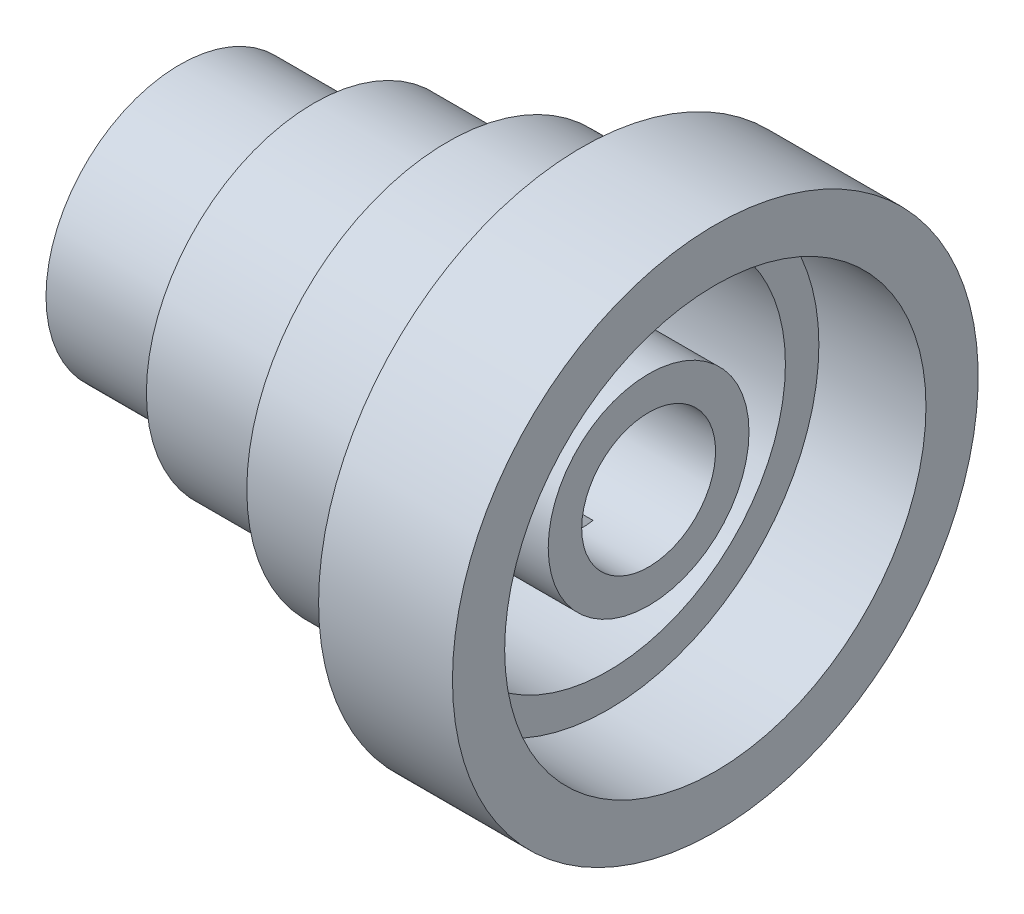
ISO-10303-21;
HEADER;
FILE_DESCRIPTION(('STEP AP214'),'2;1');
FILE_NAME('part.step','',(''),(''),'','','');
FILE_SCHEMA(('AUTOMOTIVE_DESIGN { 1 0 10303 214 1 1 1 1 }'));
ENDSEC;
DATA;
#1=APPLICATION_CONTEXT('core data for automotive mechanical design processes');
#2=APPLICATION_PROTOCOL_DEFINITION('international standard','automotive_design',2000,#1);
#3=PRODUCT_CONTEXT('',#1,'mechanical');
#4=PRODUCT('Part','Part','',(#3));
#5=PRODUCT_RELATED_PRODUCT_CATEGORY('part','',(#4));
#6=PRODUCT_DEFINITION_FORMATION('','',#4);
#7=PRODUCT_DEFINITION_CONTEXT('part definition',#1,'design');
#8=PRODUCT_DEFINITION('design','',#6,#7);
#9=PRODUCT_DEFINITION_SHAPE('','',#8);
#10=(LENGTH_UNIT() NAMED_UNIT(*) SI_UNIT(.MILLI.,.METRE.));
#11=(NAMED_UNIT(*) PLANE_ANGLE_UNIT() SI_UNIT($,.RADIAN.));
#12=(NAMED_UNIT(*) SI_UNIT($,.STERADIAN.) SOLID_ANGLE_UNIT());
#13=UNCERTAINTY_MEASURE_WITH_UNIT(LENGTH_MEASURE(1.E-05),#10,'distance_accuracy_value','');
#14=(GEOMETRIC_REPRESENTATION_CONTEXT(3) GLOBAL_UNCERTAINTY_ASSIGNED_CONTEXT((#13)) GLOBAL_UNIT_ASSIGNED_CONTEXT((#10,
#11,#12)) REPRESENTATION_CONTEXT('',''));
#15=CARTESIAN_POINT('',(0.,0.,0.));
#16=DIRECTION('',(0.,0.,1.));
#17=DIRECTION('',(1.,0.,0.));
#18=AXIS2_PLACEMENT_3D('',#15,#16,#17);
#19=CARTESIAN_POINT('',(-87.4740484429066,0.,-40.));
#20=DIRECTION('',(1.,0.,0.));
#21=DIRECTION('',(0.,0.,-1.));
#22=AXIS2_PLACEMENT_3D('',#19,#20,#21);
#23=PLANE('',#22);
#24=DIRECTION('',(0.,0.,1.));
#25=VECTOR('',#24,1.);
#26=CARTESIAN_POINT('',(-87.4740484429066,-25.786795458556,-3.47024510649693));
#27=LINE('',#26,#25);
#28=CARTESIAN_POINT('',(-87.4740484429066,-25.786795458556,-3.47024510649693));
#29=VERTEX_POINT('',#28);
#30=CARTESIAN_POINT('',(-87.4740484429066,-25.786795458556,6.86331613386226));
#31=VERTEX_POINT('',#30);
#32=EDGE_CURVE('E89',#29,#31,#27,.T.);
#33=ORIENTED_EDGE('',*,*,#32,.F.);
#34=DIRECTION('',(0.,-1.,0.));
#35=VECTOR('',#34,1.);
#36=CARTESIAN_POINT('',(-87.4740484429066,-25.786795458556,-3.47024510649693));
#37=LINE('',#36,#35);
#38=CARTESIAN_POINT('',(-87.4740484429066,-19.6966342023411,-3.47024510649693));
#39=VERTEX_POINT('',#38);
#40=EDGE_CURVE('E103',#39,#29,#37,.T.);
#41=ORIENTED_EDGE('',*,*,#40,.F.);
#42=CARTESIAN_POINT('',(-87.4740484429066,0.,0.));
#43=DIRECTION('',(-1.,0.,0.));
#44=DIRECTION('',(0.,0.,1.));
#45=AXIS2_PLACEMENT_3D('',#42,#43,#44);
#46=CIRCLE('',#45,20.);
#47=CARTESIAN_POINT('',(-87.4740484429066,-18.785496843221,6.86331613386226));
#48=VERTEX_POINT('',#47);
#49=EDGE_CURVE('E51',#48,#39,#46,.T.);
#50=ORIENTED_EDGE('',*,*,#49,.F.);
#51=DIRECTION('',(0.,1.,0.));
#52=VECTOR('',#51,1.);
#53=CARTESIAN_POINT('',(-87.4740484429066,-25.786795458556,6.86331613386226));
#54=LINE('',#53,#52);
#55=EDGE_CURVE('E106',#31,#48,#54,.T.);
#56=ORIENTED_EDGE('',*,*,#55,.F.);
#57=EDGE_LOOP('',(#33,#41,#50,#56));
#58=FACE_BOUND('',#57,.T.);
#59=CARTESIAN_POINT('',(-87.4740484429066,0.,0.));
#60=DIRECTION('',(-1.,0.,0.));
#61=DIRECTION('',(0.,0.,1.));
#62=AXIS2_PLACEMENT_3D('',#59,#60,#61);
#63=CIRCLE('',#62,40.);
#64=CARTESIAN_POINT('',(-87.4740484429066,0.,40.));
#65=VERTEX_POINT('',#64);
#66=EDGE_CURVE('E117',#65,#65,#63,.T.);
#67=ORIENTED_EDGE('',*,*,#66,.T.);
#68=EDGE_LOOP('',(#67));
#69=FACE_BOUND('',#68,.T.);
#70=ADVANCED_FACE('F43',(#58,#69),#23,.F.);
#71=CARTESIAN_POINT('',(-87.4740484429066,0.,0.));
#72=DIRECTION('',(-1.,0.,0.));
#73=DIRECTION('',(0.,0.,1.));
#74=AXIS2_PLACEMENT_3D('',#71,#72,#73);
#75=CYLINDRICAL_SURFACE('',#74,20.);
#76=ORIENTED_EDGE('',*,*,#49,.T.);
#77=DIRECTION('',(-1.,0.,0.));
#78=VECTOR('',#77,1.);
#79=CARTESIAN_POINT('',(32.5259515570934,-19.6966342023411,-3.47024510649693));
#80=LINE('',#79,#78);
#81=CARTESIAN_POINT('',(32.5259515570934,-19.6966342023411,-3.47024510649693));
#82=VERTEX_POINT('',#81);
#83=EDGE_CURVE('E118',#82,#39,#80,.T.);
#84=ORIENTED_EDGE('',*,*,#83,.F.);
#85=CARTESIAN_POINT('',(32.5259515570934,0.,0.));
#86=DIRECTION('',(-1.,0.,0.));
#87=DIRECTION('',(0.,0.,1.));
#88=AXIS2_PLACEMENT_3D('',#85,#86,#87);
#89=CIRCLE('',#88,20.);
#90=CARTESIAN_POINT('',(32.5259515570934,-18.785496843221,6.86331613386226));
#91=VERTEX_POINT('',#90);
#92=EDGE_CURVE('E11',#91,#82,#89,.F.);
#93=ORIENTED_EDGE('',*,*,#92,.F.);
#94=DIRECTION('',(-1.,0.,0.));
#95=VECTOR('',#94,1.);
#96=CARTESIAN_POINT('',(32.5259515570934,-18.785496843221,6.86331613386226));
#97=LINE('',#96,#95);
#98=EDGE_CURVE('E93',#91,#48,#97,.T.);
#99=ORIENTED_EDGE('',*,*,#98,.T.);
#100=EDGE_LOOP('',(#76,#84,#93,#99));
#101=FACE_BOUND('',#100,.T.);
#102=CARTESIAN_POINT('',(52.5951557093426,0.,0.));
#103=DIRECTION('',(-1.,0.,0.));
#104=DIRECTION('',(0.,0.,1.));
#105=AXIS2_PLACEMENT_3D('',#102,#103,#104);
#106=CIRCLE('',#105,20.);
#107=CARTESIAN_POINT('',(52.5951557093426,0.,20.));
#108=VERTEX_POINT('',#107);
#109=EDGE_CURVE('E186',#108,#108,#106,.T.);
#110=ORIENTED_EDGE('',*,*,#109,.F.);
#111=EDGE_LOOP('',(#110));
#112=FACE_BOUND('',#111,.T.);
#113=ADVANCED_FACE('F194',(#101,#112),#75,.F.);
#114=CARTESIAN_POINT('',(52.5951557093426,0.,-20.));
#115=DIRECTION('',(-1.,0.,0.));
#116=DIRECTION('',(0.,0.,1.));
#117=AXIS2_PLACEMENT_3D('',#114,#115,#116);
#118=PLANE('',#117);
#119=CARTESIAN_POINT('',(52.5951557093426,0.,0.));
#120=DIRECTION('',(-1.,0.,0.));
#121=DIRECTION('',(0.,0.,1.));
#122=AXIS2_PLACEMENT_3D('',#119,#120,#121);
#123=CIRCLE('',#122,30.);
#124=CARTESIAN_POINT('',(52.5951557093426,0.,30.));
#125=VERTEX_POINT('',#124);
#126=EDGE_CURVE('E182',#125,#125,#123,.T.);
#127=ORIENTED_EDGE('',*,*,#126,.F.);
#128=EDGE_LOOP('',(#127));
#129=FACE_BOUND('',#128,.T.);
#130=ORIENTED_EDGE('',*,*,#109,.T.);
#131=EDGE_LOOP('',(#130));
#132=FACE_BOUND('',#131,.T.);
#133=ADVANCED_FACE('F213',(#129,#132),#118,.F.);
#134=CARTESIAN_POINT('',(-87.4740484429066,0.,0.));
#135=DIRECTION('',(-1.,0.,0.));
#136=DIRECTION('',(0.,0.,1.));
#137=AXIS2_PLACEMENT_3D('',#134,#135,#136);
#138=CYLINDRICAL_SURFACE('',#137,30.);
#139=CARTESIAN_POINT('',(-39.4740484429066,0.,0.));
#140=DIRECTION('',(-1.,0.,0.));
#141=DIRECTION('',(0.,0.,1.));
#142=AXIS2_PLACEMENT_3D('',#139,#140,#141);
#143=CIRCLE('',#142,30.);
#144=CARTESIAN_POINT('',(-39.4740484429066,0.,30.));
#145=VERTEX_POINT('',#144);
#146=EDGE_CURVE('E178',#145,#145,#143,.T.);
#147=ORIENTED_EDGE('',*,*,#146,.F.);
#148=EDGE_LOOP('',(#147));
#149=FACE_BOUND('',#148,.T.);
#150=ORIENTED_EDGE('',*,*,#126,.T.);
#151=EDGE_LOOP('',(#150));
#152=FACE_BOUND('',#151,.T.);
#153=ADVANCED_FACE('F217',(#149,#152),#138,.T.);
#154=CARTESIAN_POINT('',(-39.4740484429066,0.,-30.));
#155=DIRECTION('',(-1.,0.,0.));
#156=DIRECTION('',(0.,0.,1.));
#157=AXIS2_PLACEMENT_3D('',#154,#155,#156);
#158=PLANE('',#157);
#159=CARTESIAN_POINT('',(-39.4740484429066,0.,0.));
#160=DIRECTION('',(-1.,0.,0.));
#161=DIRECTION('',(0.,0.,1.));
#162=AXIS2_PLACEMENT_3D('',#159,#160,#161);
#163=CIRCLE('',#162,40.);
#164=CARTESIAN_POINT('',(-39.4740484429066,0.,40.));
#165=VERTEX_POINT('',#164);
#166=EDGE_CURVE('E174',#165,#165,#163,.T.);
#167=ORIENTED_EDGE('',*,*,#166,.F.);
#168=EDGE_LOOP('',(#167));
#169=FACE_BOUND('',#168,.T.);
#170=ORIENTED_EDGE('',*,*,#146,.T.);
#171=EDGE_LOOP('',(#170));
#172=FACE_BOUND('',#171,.T.);
#173=ADVANCED_FACE('F223',(#169,#172),#158,.F.);
#174=CARTESIAN_POINT('',(-87.4740484429066,0.,0.));
#175=DIRECTION('',(-1.,0.,0.));
#176=DIRECTION('',(0.,0.,1.));
#177=AXIS2_PLACEMENT_3D('',#174,#175,#176);
#178=CYLINDRICAL_SURFACE('',#177,40.);
#179=CARTESIAN_POINT('',(0.525951557093368,0.,0.));
#180=DIRECTION('',(-1.,0.,0.));
#181=DIRECTION('',(0.,0.,1.));
#182=AXIS2_PLACEMENT_3D('',#179,#180,#181);
#183=CIRCLE('',#182,40.);
#184=CARTESIAN_POINT('',(0.525951557093368,0.,40.));
#185=VERTEX_POINT('',#184);
#186=EDGE_CURVE('E170',#185,#185,#183,.T.);
#187=ORIENTED_EDGE('',*,*,#186,.F.);
#188=EDGE_LOOP('',(#187));
#189=FACE_BOUND('',#188,.T.);
#190=ORIENTED_EDGE('',*,*,#166,.T.);
#191=EDGE_LOOP('',(#190));
#192=FACE_BOUND('',#191,.T.);
#193=ADVANCED_FACE('F227',(#189,#192),#178,.F.);
#194=CARTESIAN_POINT('',(0.525951557093368,0.,-40.));
#195=DIRECTION('',(-1.,0.,0.));
#196=DIRECTION('',(0.,0.,1.));
#197=AXIS2_PLACEMENT_3D('',#194,#195,#196);
#198=PLANE('',#197);
#199=CARTESIAN_POINT('',(0.525951557093368,0.,0.));
#200=DIRECTION('',(-1.,0.,0.));
#201=DIRECTION('',(0.,0.,1.));
#202=AXIS2_PLACEMENT_3D('',#199,#200,#201);
#203=CIRCLE('',#202,52.9480968858132);
#204=CARTESIAN_POINT('',(0.525951557093368,0.,52.9480968858132));
#205=VERTEX_POINT('',#204);
#206=EDGE_CURVE('E166',#205,#205,#203,.T.);
#207=ORIENTED_EDGE('',*,*,#206,.F.);
#208=EDGE_LOOP('',(#207));
#209=FACE_BOUND('',#208,.T.);
#210=ORIENTED_EDGE('',*,*,#186,.T.);
#211=EDGE_LOOP('',(#210));
#212=FACE_BOUND('',#211,.T.);
#213=ADVANCED_FACE('F231',(#209,#212),#198,.F.);
#214=CARTESIAN_POINT('',(-87.4740484429066,0.,0.));
#215=DIRECTION('',(-1.,0.,0.));
#216=DIRECTION('',(0.,0.,1.));
#217=AXIS2_PLACEMENT_3D('',#214,#215,#216);
#218=CYLINDRICAL_SURFACE('',#217,52.9480968858132);
#219=CARTESIAN_POINT('',(40.5259515570934,0.,0.));
#220=DIRECTION('',(-1.,0.,0.));
#221=DIRECTION('',(0.,0.,1.));
#222=AXIS2_PLACEMENT_3D('',#219,#220,#221);
#223=CIRCLE('',#222,52.9480968858132);
#224=CARTESIAN_POINT('',(40.5259515570934,0.,52.9480968858132));
#225=VERTEX_POINT('',#224);
#226=EDGE_CURVE('E162',#225,#225,#223,.T.);
#227=ORIENTED_EDGE('',*,*,#226,.F.);
#228=EDGE_LOOP('',(#227));
#229=FACE_BOUND('',#228,.T.);
#230=ORIENTED_EDGE('',*,*,#206,.T.);
#231=EDGE_LOOP('',(#230));
#232=FACE_BOUND('',#231,.T.);
#233=ADVANCED_FACE('F235',(#229,#232),#218,.F.);
#234=CARTESIAN_POINT('',(40.5259515570934,0.,-52.9480968858132));
#235=DIRECTION('',(-1.,0.,0.));
#236=DIRECTION('',(0.,0.,1.));
#237=AXIS2_PLACEMENT_3D('',#234,#235,#236);
#238=PLANE('',#237);
#239=CARTESIAN_POINT('',(40.5259515570934,0.,0.));
#240=DIRECTION('',(-1.,0.,0.));
#241=DIRECTION('',(0.,0.,1.));
#242=AXIS2_PLACEMENT_3D('',#239,#240,#241);
#243=CIRCLE('',#242,62.9480968858132);
#244=CARTESIAN_POINT('',(40.5259515570934,0.,62.9480968858132));
#245=VERTEX_POINT('',#244);
#246=EDGE_CURVE('E158',#245,#245,#243,.T.);
#247=ORIENTED_EDGE('',*,*,#246,.F.);
#248=EDGE_LOOP('',(#247));
#249=FACE_BOUND('',#248,.T.);
#250=ORIENTED_EDGE('',*,*,#226,.T.);
#251=EDGE_LOOP('',(#250));
#252=FACE_BOUND('',#251,.T.);
#253=ADVANCED_FACE('F239',(#249,#252),#238,.F.);
#254=CARTESIAN_POINT('',(-87.4740484429066,0.,0.));
#255=DIRECTION('',(-1.,0.,0.));
#256=DIRECTION('',(0.,0.,1.));
#257=AXIS2_PLACEMENT_3D('',#254,#255,#256);
#258=CYLINDRICAL_SURFACE('',#257,62.9480968858132);
#259=CARTESIAN_POINT('',(72.5259515570934,0.,0.));
#260=DIRECTION('',(-1.,0.,0.));
#261=DIRECTION('',(0.,0.,1.));
#262=AXIS2_PLACEMENT_3D('',#259,#260,#261);
#263=CIRCLE('',#262,62.9480968858132);
#264=CARTESIAN_POINT('',(72.5259515570934,0.,62.9480968858132));
#265=VERTEX_POINT('',#264);
#266=EDGE_CURVE('E154',#265,#265,#263,.T.);
#267=ORIENTED_EDGE('',*,*,#266,.F.);
#268=EDGE_LOOP('',(#267));
#269=FACE_BOUND('',#268,.T.);
#270=ORIENTED_EDGE('',*,*,#246,.T.);
#271=EDGE_LOOP('',(#270));
#272=FACE_BOUND('',#271,.T.);
#273=ADVANCED_FACE('F243',(#269,#272),#258,.F.);
#274=CARTESIAN_POINT('',(72.5259515570934,0.,-62.9480968858132));
#275=DIRECTION('',(-1.,0.,0.));
#276=DIRECTION('',(0.,0.,1.));
#277=AXIS2_PLACEMENT_3D('',#274,#275,#276);
#278=PLANE('',#277);
#279=CARTESIAN_POINT('',(72.5259515570934,0.,0.));
#280=DIRECTION('',(-1.,0.,0.));
#281=DIRECTION('',(0.,0.,1.));
#282=AXIS2_PLACEMENT_3D('',#279,#280,#281);
#283=CIRCLE('',#282,78.5467128027682);
#284=CARTESIAN_POINT('',(72.5259515570934,0.,78.5467128027682));
#285=VERTEX_POINT('',#284);
#286=EDGE_CURVE('E150',#285,#285,#283,.T.);
#287=ORIENTED_EDGE('',*,*,#286,.F.);
#288=EDGE_LOOP('',(#287));
#289=FACE_BOUND('',#288,.T.);
#290=ORIENTED_EDGE('',*,*,#266,.T.);
#291=EDGE_LOOP('',(#290));
#292=FACE_BOUND('',#291,.T.);
#293=ADVANCED_FACE('F247',(#289,#292),#278,.F.);
#294=CARTESIAN_POINT('',(-87.4740484429066,0.,0.));
#295=DIRECTION('',(-1.,0.,0.));
#296=DIRECTION('',(0.,0.,1.));
#297=AXIS2_PLACEMENT_3D('',#294,#295,#296);
#298=CYLINDRICAL_SURFACE('',#297,78.5467128027682);
#299=CARTESIAN_POINT('',(32.5259515570934,0.,0.));
#300=DIRECTION('',(-1.,0.,0.));
#301=DIRECTION('',(0.,0.,1.));
#302=AXIS2_PLACEMENT_3D('',#299,#300,#301);
#303=CIRCLE('',#302,78.5467128027682);
#304=CARTESIAN_POINT('',(32.5259515570934,0.,78.5467128027682));
#305=VERTEX_POINT('',#304);
#306=EDGE_CURVE('E146',#305,#305,#303,.T.);
#307=ORIENTED_EDGE('',*,*,#306,.F.);
#308=EDGE_LOOP('',(#307));
#309=FACE_BOUND('',#308,.T.);
#310=ORIENTED_EDGE('',*,*,#286,.T.);
#311=EDGE_LOOP('',(#310));
#312=FACE_BOUND('',#311,.T.);
#313=ADVANCED_FACE('F251',(#309,#312),#298,.T.);
#314=CARTESIAN_POINT('',(32.5259515570934,0.,-78.5467128027682));
#315=DIRECTION('',(1.,0.,0.));
#316=DIRECTION('',(0.,0.,-1.));
#317=AXIS2_PLACEMENT_3D('',#314,#315,#316);
#318=PLANE('',#317);
#319=CARTESIAN_POINT('',(32.5259515570934,0.,0.));
#320=DIRECTION('',(-1.,0.,0.));
#321=DIRECTION('',(0.,0.,1.));
#322=AXIS2_PLACEMENT_3D('',#319,#320,#321);
#323=CIRCLE('',#322,60.);
#324=CARTESIAN_POINT('',(32.5259515570934,0.,60.));
#325=VERTEX_POINT('',#324);
#326=EDGE_CURVE('E142',#325,#325,#323,.T.);
#327=ORIENTED_EDGE('',*,*,#326,.F.);
#328=EDGE_LOOP('',(#327));
#329=FACE_BOUND('',#328,.T.);
#330=ORIENTED_EDGE('',*,*,#306,.T.);
#331=EDGE_LOOP('',(#330));
#332=FACE_BOUND('',#331,.T.);
#333=ADVANCED_FACE('F255',(#329,#332),#318,.F.);
#334=CARTESIAN_POINT('',(-87.4740484429066,0.,0.));
#335=DIRECTION('',(-1.,0.,0.));
#336=DIRECTION('',(0.,0.,1.));
#337=AXIS2_PLACEMENT_3D('',#334,#335,#336);
#338=CYLINDRICAL_SURFACE('',#337,60.);
#339=CARTESIAN_POINT('',(-7.47404844290664,0.,0.));
#340=DIRECTION('',(-1.,0.,0.));
#341=DIRECTION('',(0.,0.,1.));
#342=AXIS2_PLACEMENT_3D('',#339,#340,#341);
#343=CIRCLE('',#342,60.);
#344=CARTESIAN_POINT('',(-7.47404844290664,0.,60.));
#345=VERTEX_POINT('',#344);
#346=EDGE_CURVE('E138',#345,#345,#343,.T.);
#347=ORIENTED_EDGE('',*,*,#346,.F.);
#348=EDGE_LOOP('',(#347));
#349=FACE_BOUND('',#348,.T.);
#350=ORIENTED_EDGE('',*,*,#326,.T.);
#351=EDGE_LOOP('',(#350));
#352=FACE_BOUND('',#351,.T.);
#353=ADVANCED_FACE('F259',(#349,#352),#338,.T.);
#354=CARTESIAN_POINT('',(-7.47404844290663,0.,-60.));
#355=DIRECTION('',(1.,0.,0.));
#356=DIRECTION('',(0.,0.,-1.));
#357=AXIS2_PLACEMENT_3D('',#354,#355,#356);
#358=PLANE('',#357);
#359=CARTESIAN_POINT('',(-7.47404844290664,0.,0.));
#360=DIRECTION('',(-1.,0.,0.));
#361=DIRECTION('',(0.,0.,1.));
#362=AXIS2_PLACEMENT_3D('',#359,#360,#361);
#363=CIRCLE('',#362,50.);
#364=CARTESIAN_POINT('',(-7.47404844290664,0.,50.));
#365=VERTEX_POINT('',#364);
#366=EDGE_CURVE('E134',#365,#365,#363,.T.);
#367=ORIENTED_EDGE('',*,*,#366,.F.);
#368=EDGE_LOOP('',(#367));
#369=FACE_BOUND('',#368,.T.);
#370=ORIENTED_EDGE('',*,*,#346,.T.);
#371=EDGE_LOOP('',(#370));
#372=FACE_BOUND('',#371,.T.);
#373=ADVANCED_FACE('F263',(#369,#372),#358,.F.);
#374=CARTESIAN_POINT('',(-87.4740484429066,0.,0.));
#375=DIRECTION('',(-1.,0.,0.));
#376=DIRECTION('',(0.,0.,1.));
#377=AXIS2_PLACEMENT_3D('',#374,#375,#376);
#378=CYLINDRICAL_SURFACE('',#377,50.);
#379=CARTESIAN_POINT('',(-47.4740484429066,0.,0.));
#380=DIRECTION('',(-1.,0.,0.));
#381=DIRECTION('',(0.,0.,1.));
#382=AXIS2_PLACEMENT_3D('',#379,#380,#381);
#383=CIRCLE('',#382,50.);
#384=CARTESIAN_POINT('',(-47.4740484429066,0.,50.));
#385=VERTEX_POINT('',#384);
#386=EDGE_CURVE('E130',#385,#385,#383,.T.);
#387=ORIENTED_EDGE('',*,*,#386,.F.);
#388=EDGE_LOOP('',(#387));
#389=FACE_BOUND('',#388,.T.);
#390=ORIENTED_EDGE('',*,*,#366,.T.);
#391=EDGE_LOOP('',(#390));
#392=FACE_BOUND('',#391,.T.);
#393=ADVANCED_FACE('F267',(#389,#392),#378,.T.);
#394=CARTESIAN_POINT('',(-47.4740484429066,0.,-50.));
#395=DIRECTION('',(1.,0.,0.));
#396=DIRECTION('',(0.,0.,-1.));
#397=AXIS2_PLACEMENT_3D('',#394,#395,#396);
#398=PLANE('',#397);
#399=CARTESIAN_POINT('',(-47.4740484429066,0.,0.));
#400=DIRECTION('',(-1.,0.,0.));
#401=DIRECTION('',(0.,0.,1.));
#402=AXIS2_PLACEMENT_3D('',#399,#400,#401);
#403=CIRCLE('',#402,40.);
#404=CARTESIAN_POINT('',(-47.4740484429066,0.,40.));
#405=VERTEX_POINT('',#404);
#406=EDGE_CURVE('E126',#405,#405,#403,.T.);
#407=ORIENTED_EDGE('',*,*,#406,.F.);
#408=EDGE_LOOP('',(#407));
#409=FACE_BOUND('',#408,.T.);
#410=ORIENTED_EDGE('',*,*,#386,.T.);
#411=EDGE_LOOP('',(#410));
#412=FACE_BOUND('',#411,.T.);
#413=ADVANCED_FACE('F271',(#409,#412),#398,.F.);
#414=CARTESIAN_POINT('',(-87.4740484429066,0.,0.));
#415=DIRECTION('',(-1.,0.,0.));
#416=DIRECTION('',(0.,0.,1.));
#417=AXIS2_PLACEMENT_3D('',#414,#415,#416);
#418=CYLINDRICAL_SURFACE('',#417,40.);
#419=ORIENTED_EDGE('',*,*,#66,.F.);
#420=EDGE_LOOP('',(#419));
#421=FACE_BOUND('',#420,.T.);
#422=ORIENTED_EDGE('',*,*,#406,.T.);
#423=EDGE_LOOP('',(#422));
#424=FACE_BOUND('',#423,.T.);
#425=ADVANCED_FACE('F275',(#421,#424),#418,.T.);
#426=CARTESIAN_POINT('',(32.5259515570934,0.,0.));
#427=DIRECTION('',(-1.,0.,0.));
#428=DIRECTION('',(0.,0.,1.));
#429=AXIS2_PLACEMENT_3D('',#426,#427,#428);
#430=PLANE('',#429);
#431=ORIENTED_EDGE('',*,*,#92,.T.);
#432=DIRECTION('',(0.,-1.,0.));
#433=VECTOR('',#432,1.);
#434=CARTESIAN_POINT('',(32.5259515570934,-25.786795458556,-3.47024510649693));
#435=LINE('',#434,#433);
#436=CARTESIAN_POINT('',(32.5259515570934,-25.786795458556,-3.47024510649693));
#437=VERTEX_POINT('',#436);
#438=EDGE_CURVE('E94',#82,#437,#435,.T.);
#439=ORIENTED_EDGE('',*,*,#438,.T.);
#440=DIRECTION('',(0.,0.,1.));
#441=VECTOR('',#440,1.);
#442=CARTESIAN_POINT('',(32.5259515570934,-25.786795458556,-3.47024510649693));
#443=LINE('',#442,#441);
#444=CARTESIAN_POINT('',(32.5259515570934,-25.786795458556,6.86331613386226));
#445=VERTEX_POINT('',#444);
#446=EDGE_CURVE('E86',#437,#445,#443,.T.);
#447=ORIENTED_EDGE('',*,*,#446,.T.);
#448=DIRECTION('',(0.,1.,0.));
#449=VECTOR('',#448,1.);
#450=CARTESIAN_POINT('',(32.5259515570934,-25.786795458556,6.86331613386226));
#451=LINE('',#450,#449);
#452=EDGE_CURVE('E57',#445,#91,#451,.T.);
#453=ORIENTED_EDGE('',*,*,#452,.T.);
#454=EDGE_LOOP('',(#431,#439,#447,#453));
#455=FACE_BOUND('',#454,.T.);
#456=ADVANCED_FACE('F101',(#455),#430,.T.);
#457=CARTESIAN_POINT('',(32.5259515570934,-25.786795458556,-3.47024510649693));
#458=DIRECTION('',(0.,-1.,0.));
#459=DIRECTION('',(0.,0.,-1.));
#460=AXIS2_PLACEMENT_3D('',#457,#458,#459);
#461=PLANE('',#460);
#462=ORIENTED_EDGE('',*,*,#32,.T.);
#463=DIRECTION('',(-1.,0.,0.));
#464=VECTOR('',#463,1.);
#465=CARTESIAN_POINT('',(32.5259515570934,-25.786795458556,6.86331613386226));
#466=LINE('',#465,#464);
#467=EDGE_CURVE('E84',#445,#31,#466,.T.);
#468=ORIENTED_EDGE('',*,*,#467,.F.);
#469=ORIENTED_EDGE('',*,*,#446,.F.);
#470=DIRECTION('',(-1.,0.,0.));
#471=VECTOR('',#470,1.);
#472=CARTESIAN_POINT('',(32.5259515570934,-25.786795458556,-3.47024510649693));
#473=LINE('',#472,#471);
#474=EDGE_CURVE('E66',#437,#29,#473,.T.);
#475=ORIENTED_EDGE('',*,*,#474,.T.);
#476=EDGE_LOOP('',(#462,#468,#469,#475));
#477=FACE_BOUND('',#476,.T.);
#478=ADVANCED_FACE('F85',(#477),#461,.F.);
#479=CARTESIAN_POINT('',(32.5259515570934,-25.786795458556,-3.47024510649693));
#480=DIRECTION('',(0.,0.,-1.));
#481=DIRECTION('',(-1.,0.,0.));
#482=AXIS2_PLACEMENT_3D('',#479,#480,#481);
#483=PLANE('',#482);
#484=ORIENTED_EDGE('',*,*,#40,.T.);
#485=ORIENTED_EDGE('',*,*,#474,.F.);
#486=ORIENTED_EDGE('',*,*,#438,.F.);
#487=ORIENTED_EDGE('',*,*,#83,.T.);
#488=EDGE_LOOP('',(#484,#485,#486,#487));
#489=FACE_BOUND('',#488,.T.);
#490=ADVANCED_FACE('F199',(#489),#483,.F.);
#491=CARTESIAN_POINT('',(32.5259515570934,-25.786795458556,6.86331613386226));
#492=DIRECTION('',(0.,0.,1.));
#493=DIRECTION('',(1.,0.,0.));
#494=AXIS2_PLACEMENT_3D('',#491,#492,#493);
#495=PLANE('',#494);
#496=ORIENTED_EDGE('',*,*,#55,.T.);
#497=ORIENTED_EDGE('',*,*,#98,.F.);
#498=ORIENTED_EDGE('',*,*,#452,.F.);
#499=ORIENTED_EDGE('',*,*,#467,.T.);
#500=EDGE_LOOP('',(#496,#497,#498,#499));
#501=FACE_BOUND('',#500,.T.);
#502=ADVANCED_FACE('F96',(#501),#495,.F.);
#503=CLOSED_SHELL('',(#70,#113,#133,#153,#173,#193,#213,#233,#253,#273,#293,#313,#333,#353,#373,
#393,#413,#425,#456,#478,#490,#502));
#504=MANIFOLD_SOLID_BREP('B2',#503);
#505=ADVANCED_BREP_SHAPE_REPRESENTATION('',(#18,#504),#14);
#506=SHAPE_DEFINITION_REPRESENTATION(#9,#505);
ENDSEC;
END-ISO-10303-21;
